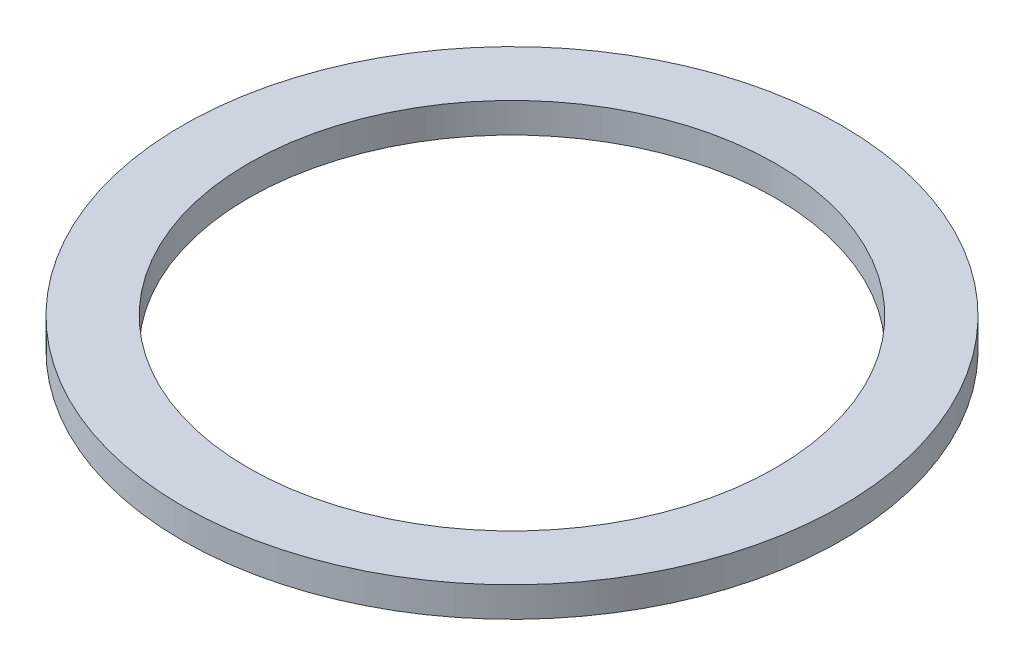
ISO-10303-21;
HEADER;
FILE_DESCRIPTION(('STEP AP214'),'2;1');
FILE_NAME('part.step','',(''),(''),'','','');
FILE_SCHEMA(('AUTOMOTIVE_DESIGN { 1 0 10303 214 1 1 1 1 }'));
ENDSEC;
DATA;
#1=APPLICATION_CONTEXT('core data for automotive mechanical design processes');
#2=APPLICATION_PROTOCOL_DEFINITION('international standard','automotive_design',2000,#1);
#3=PRODUCT_CONTEXT('',#1,'mechanical');
#4=PRODUCT('Part','Part','',(#3));
#5=PRODUCT_RELATED_PRODUCT_CATEGORY('part','',(#4));
#6=PRODUCT_DEFINITION_FORMATION('','',#4);
#7=PRODUCT_DEFINITION_CONTEXT('part definition',#1,'design');
#8=PRODUCT_DEFINITION('design','',#6,#7);
#9=PRODUCT_DEFINITION_SHAPE('','',#8);
#10=(LENGTH_UNIT() NAMED_UNIT(*) SI_UNIT(.MILLI.,.METRE.));
#11=(NAMED_UNIT(*) PLANE_ANGLE_UNIT() SI_UNIT($,.RADIAN.));
#12=(NAMED_UNIT(*) SI_UNIT($,.STERADIAN.) SOLID_ANGLE_UNIT());
#13=UNCERTAINTY_MEASURE_WITH_UNIT(LENGTH_MEASURE(1.E-05),#10,'distance_accuracy_value','');
#14=(GEOMETRIC_REPRESENTATION_CONTEXT(3) GLOBAL_UNCERTAINTY_ASSIGNED_CONTEXT((#13)) GLOBAL_UNIT_ASSIGNED_CONTEXT((#10,
#11,#12)) REPRESENTATION_CONTEXT('',''));
#15=CARTESIAN_POINT('',(0.,0.,0.));
#16=DIRECTION('',(0.,0.,1.));
#17=DIRECTION('',(1.,0.,0.));
#18=AXIS2_PLACEMENT_3D('',#15,#16,#17);
#19=CARTESIAN_POINT('',(0.,12.5,220.));
#20=DIRECTION('',(0.,1.,0.));
#21=DIRECTION('',(0.,0.,1.));
#22=AXIS2_PLACEMENT_3D('',#19,#20,#21);
#23=PLANE('',#22);
#24=CARTESIAN_POINT('',(0.,12.5,0.));
#25=DIRECTION('',(0.,1.,0.));
#26=DIRECTION('',(0.,0.,1.));
#27=AXIS2_PLACEMENT_3D('',#24,#25,#26);
#28=CIRCLE('',#27,275.);
#29=CARTESIAN_POINT('',(0.,12.5,275.));
#30=VERTEX_POINT('',#29);
#31=EDGE_CURVE('E10',#30,#30,#28,.T.);
#32=ORIENTED_EDGE('',*,*,#31,.T.);
#33=EDGE_LOOP('',(#32));
#34=FACE_BOUND('',#33,.T.);
#35=CARTESIAN_POINT('',(0.,12.5,0.));
#36=DIRECTION('',(0.,1.,0.));
#37=DIRECTION('',(0.,0.,1.));
#38=AXIS2_PLACEMENT_3D('',#35,#36,#37);
#39=CIRCLE('',#38,220.);
#40=CARTESIAN_POINT('',(0.,12.5,220.));
#41=VERTEX_POINT('',#40);
#42=EDGE_CURVE('E56',#41,#41,#39,.T.);
#43=ORIENTED_EDGE('',*,*,#42,.F.);
#44=EDGE_LOOP('',(#43));
#45=FACE_BOUND('',#44,.T.);
#46=ADVANCED_FACE('F39',(#34,#45),#23,.T.);
#47=CARTESIAN_POINT('',(0.,166.77545691906,0.));
#48=DIRECTION('',(0.,1.,0.));
#49=DIRECTION('',(0.,0.,1.));
#50=AXIS2_PLACEMENT_3D('',#47,#48,#49);
#51=CYLINDRICAL_SURFACE('',#50,275.);
#52=CARTESIAN_POINT('',(0.,-12.5,0.));
#53=DIRECTION('',(0.,1.,0.));
#54=DIRECTION('',(0.,0.,1.));
#55=AXIS2_PLACEMENT_3D('',#52,#53,#54);
#56=CIRCLE('',#55,275.);
#57=CARTESIAN_POINT('',(0.,-12.5,275.));
#58=VERTEX_POINT('',#57);
#59=EDGE_CURVE('E46',#58,#58,#56,.T.);
#60=ORIENTED_EDGE('',*,*,#59,.T.);
#61=EDGE_LOOP('',(#60));
#62=FACE_BOUND('',#61,.T.);
#63=ORIENTED_EDGE('',*,*,#31,.F.);
#64=EDGE_LOOP('',(#63));
#65=FACE_BOUND('',#64,.T.);
#66=ADVANCED_FACE('F67',(#62,#65),#51,.T.);
#67=CARTESIAN_POINT('',(0.,-12.5,275.));
#68=DIRECTION('',(0.,-1.,0.));
#69=DIRECTION('',(0.,0.,-1.));
#70=AXIS2_PLACEMENT_3D('',#67,#68,#69);
#71=PLANE('',#70);
#72=CARTESIAN_POINT('',(0.,-12.5,0.));
#73=DIRECTION('',(0.,1.,0.));
#74=DIRECTION('',(0.,0.,1.));
#75=AXIS2_PLACEMENT_3D('',#72,#73,#74);
#76=CIRCLE('',#75,220.);
#77=CARTESIAN_POINT('',(0.,-12.5,220.));
#78=VERTEX_POINT('',#77);
#79=EDGE_CURVE('E51',#78,#78,#76,.T.);
#80=ORIENTED_EDGE('',*,*,#79,.T.);
#81=EDGE_LOOP('',(#80));
#82=FACE_BOUND('',#81,.T.);
#83=ORIENTED_EDGE('',*,*,#59,.F.);
#84=EDGE_LOOP('',(#83));
#85=FACE_BOUND('',#84,.T.);
#86=ADVANCED_FACE('F71',(#82,#85),#71,.T.);
#87=CARTESIAN_POINT('',(0.,166.77545691906,0.));
#88=DIRECTION('',(0.,1.,0.));
#89=DIRECTION('',(0.,0.,1.));
#90=AXIS2_PLACEMENT_3D('',#87,#88,#89);
#91=CYLINDRICAL_SURFACE('',#90,220.);
#92=ORIENTED_EDGE('',*,*,#42,.T.);
#93=EDGE_LOOP('',(#92));
#94=FACE_BOUND('',#93,.T.);
#95=ORIENTED_EDGE('',*,*,#79,.F.);
#96=EDGE_LOOP('',(#95));
#97=FACE_BOUND('',#96,.T.);
#98=ADVANCED_FACE('F63',(#94,#97),#91,.F.);
#99=CLOSED_SHELL('',(#46,#66,#86,#98));
#100=MANIFOLD_SOLID_BREP('B2',#99);
#101=ADVANCED_BREP_SHAPE_REPRESENTATION('',(#18,#100),#14);
#102=SHAPE_DEFINITION_REPRESENTATION(#9,#101);
ENDSEC;
END-ISO-10303-21;
